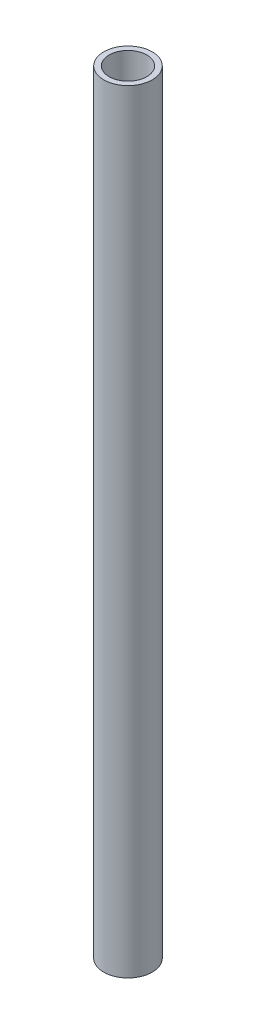
ISO-10303-21;
HEADER;
FILE_DESCRIPTION(('STEP AP214'),'2;1');
FILE_NAME('part.step','',(''),(''),'','','');
FILE_SCHEMA(('AUTOMOTIVE_DESIGN { 1 0 10303 214 1 1 1 1 }'));
ENDSEC;
DATA;
#1=APPLICATION_CONTEXT('core data for automotive mechanical design processes');
#2=APPLICATION_PROTOCOL_DEFINITION('international standard','automotive_design',2000,#1);
#3=PRODUCT_CONTEXT('',#1,'mechanical');
#4=PRODUCT('Part','Part','',(#3));
#5=PRODUCT_RELATED_PRODUCT_CATEGORY('part','',(#4));
#6=PRODUCT_DEFINITION_FORMATION('','',#4);
#7=PRODUCT_DEFINITION_CONTEXT('part definition',#1,'design');
#8=PRODUCT_DEFINITION('design','',#6,#7);
#9=PRODUCT_DEFINITION_SHAPE('','',#8);
#10=(LENGTH_UNIT() NAMED_UNIT(*) SI_UNIT(.MILLI.,.METRE.));
#11=(NAMED_UNIT(*) PLANE_ANGLE_UNIT() SI_UNIT($,.RADIAN.));
#12=(NAMED_UNIT(*) SI_UNIT($,.STERADIAN.) SOLID_ANGLE_UNIT());
#13=UNCERTAINTY_MEASURE_WITH_UNIT(LENGTH_MEASURE(1.E-05),#10,'distance_accuracy_value','');
#14=(GEOMETRIC_REPRESENTATION_CONTEXT(3) GLOBAL_UNCERTAINTY_ASSIGNED_CONTEXT((#13)) GLOBAL_UNIT_ASSIGNED_CONTEXT((#10,
#11,#12)) REPRESENTATION_CONTEXT('',''));
#15=CARTESIAN_POINT('',(0.,0.,0.));
#16=DIRECTION('',(0.,0.,1.));
#17=DIRECTION('',(1.,0.,0.));
#18=AXIS2_PLACEMENT_3D('',#15,#16,#17);
#19=CARTESIAN_POINT('',(0.,50.,0.));
#20=DIRECTION('',(0.,1.,0.));
#21=DIRECTION('',(0.,0.,1.));
#22=AXIS2_PLACEMENT_3D('',#19,#20,#21);
#23=PLANE('',#22);
#24=CARTESIAN_POINT('',(0.,50.,0.));
#25=DIRECTION('',(0.,1.,0.));
#26=DIRECTION('',(0.,0.,1.));
#27=AXIS2_PLACEMENT_3D('',#24,#25,#26);
#28=CIRCLE('',#27,1.57);
#29=CARTESIAN_POINT('',(0.,50.,1.57));
#30=VERTEX_POINT('',#29);
#31=EDGE_CURVE('E10',#30,#30,#28,.T.);
#32=ORIENTED_EDGE('',*,*,#31,.T.);
#33=EDGE_LOOP('',(#32));
#34=FACE_BOUND('',#33,.T.);
#35=CARTESIAN_POINT('',(0.,50.,0.));
#36=DIRECTION('',(0.,1.,0.));
#37=DIRECTION('',(0.,0.,1.));
#38=AXIS2_PLACEMENT_3D('',#35,#36,#37);
#39=CIRCLE('',#38,1.22);
#40=CARTESIAN_POINT('',(0.,50.,1.22));
#41=VERTEX_POINT('',#40);
#42=EDGE_CURVE('E54',#41,#41,#39,.T.);
#43=ORIENTED_EDGE('',*,*,#42,.F.);
#44=EDGE_LOOP('',(#43));
#45=FACE_BOUND('',#44,.T.);
#46=ADVANCED_FACE('F41',(#34,#45),#23,.T.);
#47=CARTESIAN_POINT('',(0.,0.,0.));
#48=DIRECTION('',(0.,1.,0.));
#49=DIRECTION('',(0.,0.,1.));
#50=AXIS2_PLACEMENT_3D('',#47,#48,#49);
#51=PLANE('',#50);
#52=CARTESIAN_POINT('',(0.,0.,0.));
#53=DIRECTION('',(0.,1.,0.));
#54=DIRECTION('',(0.,0.,1.));
#55=AXIS2_PLACEMENT_3D('',#52,#53,#54);
#56=CIRCLE('',#55,1.57);
#57=CARTESIAN_POINT('',(0.,0.,1.57));
#58=VERTEX_POINT('',#57);
#59=EDGE_CURVE('E45',#58,#58,#56,.T.);
#60=ORIENTED_EDGE('',*,*,#59,.F.);
#61=EDGE_LOOP('',(#60));
#62=FACE_BOUND('',#61,.T.);
#63=CARTESIAN_POINT('',(0.,0.,0.));
#64=DIRECTION('',(0.,1.,0.));
#65=DIRECTION('',(0.,0.,1.));
#66=AXIS2_PLACEMENT_3D('',#63,#64,#65);
#67=CIRCLE('',#66,1.22);
#68=CARTESIAN_POINT('',(0.,0.,1.22));
#69=VERTEX_POINT('',#68);
#70=EDGE_CURVE('E56',#69,#69,#67,.T.);
#71=ORIENTED_EDGE('',*,*,#70,.T.);
#72=EDGE_LOOP('',(#71));
#73=FACE_BOUND('',#72,.T.);
#74=ADVANCED_FACE('F68',(#62,#73),#51,.F.);
#75=CARTESIAN_POINT('',(0.,50.,0.));
#76=DIRECTION('',(0.,-1.,0.));
#77=DIRECTION('',(0.,0.,-1.));
#78=AXIS2_PLACEMENT_3D('',#75,#76,#77);
#79=CYLINDRICAL_SURFACE('',#78,1.57);
#80=ORIENTED_EDGE('',*,*,#31,.F.);
#81=EDGE_LOOP('',(#80));
#82=FACE_BOUND('',#81,.T.);
#83=ORIENTED_EDGE('',*,*,#59,.T.);
#84=EDGE_LOOP('',(#83));
#85=FACE_BOUND('',#84,.T.);
#86=ADVANCED_FACE('F43',(#82,#85),#79,.T.);
#87=CARTESIAN_POINT('',(0.,50.,0.));
#88=DIRECTION('',(0.,-1.,0.));
#89=DIRECTION('',(0.,0.,-1.));
#90=AXIS2_PLACEMENT_3D('',#87,#88,#89);
#91=CYLINDRICAL_SURFACE('',#90,1.22);
#92=ORIENTED_EDGE('',*,*,#42,.T.);
#93=EDGE_LOOP('',(#92));
#94=FACE_BOUND('',#93,.T.);
#95=ORIENTED_EDGE('',*,*,#70,.F.);
#96=EDGE_LOOP('',(#95));
#97=FACE_BOUND('',#96,.T.);
#98=ADVANCED_FACE('F64',(#94,#97),#91,.F.);
#99=CLOSED_SHELL('',(#46,#74,#86,#98));
#100=MANIFOLD_SOLID_BREP('B2',#99);
#101=ADVANCED_BREP_SHAPE_REPRESENTATION('',(#18,#100),#14);
#102=SHAPE_DEFINITION_REPRESENTATION(#9,#101);
ENDSEC;
END-ISO-10303-21;
